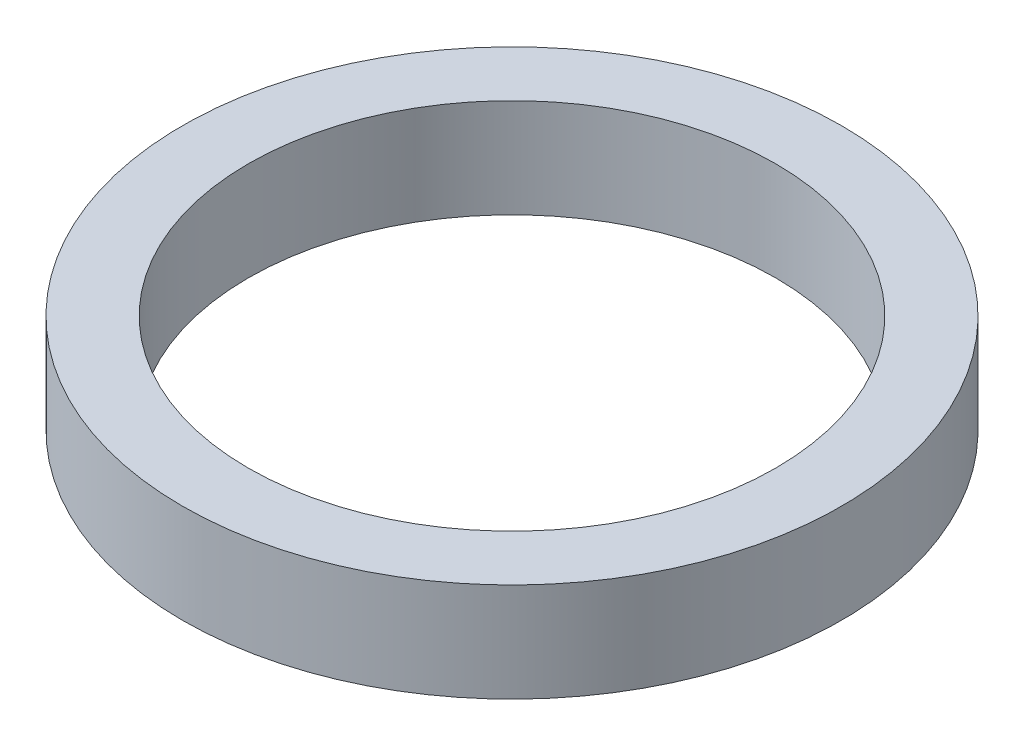
ISO-10303-21;
HEADER;
FILE_DESCRIPTION(('STEP AP214'),'2;1');
FILE_NAME('part.step','',(''),(''),'','','');
FILE_SCHEMA(('AUTOMOTIVE_DESIGN { 1 0 10303 214 1 1 1 1 }'));
ENDSEC;
DATA;
#1=APPLICATION_CONTEXT('core data for automotive mechanical design processes');
#2=APPLICATION_PROTOCOL_DEFINITION('international standard','automotive_design',2000,#1);
#3=PRODUCT_CONTEXT('',#1,'mechanical');
#4=PRODUCT('Part','Part','',(#3));
#5=PRODUCT_RELATED_PRODUCT_CATEGORY('part','',(#4));
#6=PRODUCT_DEFINITION_FORMATION('','',#4);
#7=PRODUCT_DEFINITION_CONTEXT('part definition',#1,'design');
#8=PRODUCT_DEFINITION('design','',#6,#7);
#9=PRODUCT_DEFINITION_SHAPE('','',#8);
#10=(LENGTH_UNIT() NAMED_UNIT(*) SI_UNIT(.MILLI.,.METRE.));
#11=(NAMED_UNIT(*) PLANE_ANGLE_UNIT() SI_UNIT($,.RADIAN.));
#12=(NAMED_UNIT(*) SI_UNIT($,.STERADIAN.) SOLID_ANGLE_UNIT());
#13=UNCERTAINTY_MEASURE_WITH_UNIT(LENGTH_MEASURE(1.E-05),#10,'distance_accuracy_value','');
#14=(GEOMETRIC_REPRESENTATION_CONTEXT(3) GLOBAL_UNCERTAINTY_ASSIGNED_CONTEXT((#13)) GLOBAL_UNIT_ASSIGNED_CONTEXT((#10,
#11,#12)) REPRESENTATION_CONTEXT('',''));
#15=CARTESIAN_POINT('',(0.,0.,0.));
#16=DIRECTION('',(0.,0.,1.));
#17=DIRECTION('',(1.,0.,0.));
#18=AXIS2_PLACEMENT_3D('',#15,#16,#17);
#19=CARTESIAN_POINT('',(0.,1.5,0.));
#20=DIRECTION('',(0.,1.,0.));
#21=DIRECTION('',(0.,0.,1.));
#22=AXIS2_PLACEMENT_3D('',#19,#20,#21);
#23=PLANE('',#22);
#24=CARTESIAN_POINT('',(0.,1.5,0.));
#25=DIRECTION('',(0.,1.,0.));
#26=DIRECTION('',(0.,0.,1.));
#27=AXIS2_PLACEMENT_3D('',#24,#25,#26);
#28=CIRCLE('',#27,5.);
#29=CARTESIAN_POINT('',(0.,1.5,5.));
#30=VERTEX_POINT('',#29);
#31=EDGE_CURVE('E10',#30,#30,#28,.T.);
#32=ORIENTED_EDGE('',*,*,#31,.T.);
#33=EDGE_LOOP('',(#32));
#34=FACE_BOUND('',#33,.T.);
#35=CARTESIAN_POINT('',(0.,1.5,0.));
#36=DIRECTION('',(0.,1.,0.));
#37=DIRECTION('',(0.,0.,1.));
#38=AXIS2_PLACEMENT_3D('',#35,#36,#37);
#39=CIRCLE('',#38,4.);
#40=CARTESIAN_POINT('',(0.,1.5,4.));
#41=VERTEX_POINT('',#40);
#42=EDGE_CURVE('E50',#41,#41,#39,.T.);
#43=ORIENTED_EDGE('',*,*,#42,.F.);
#44=EDGE_LOOP('',(#43));
#45=FACE_BOUND('',#44,.T.);
#46=ADVANCED_FACE('F37',(#34,#45),#23,.T.);
#47=CARTESIAN_POINT('',(0.,0.,0.));
#48=DIRECTION('',(0.,1.,0.));
#49=DIRECTION('',(0.,0.,1.));
#50=AXIS2_PLACEMENT_3D('',#47,#48,#49);
#51=PLANE('',#50);
#52=CARTESIAN_POINT('',(0.,0.,0.));
#53=DIRECTION('',(0.,1.,0.));
#54=DIRECTION('',(0.,0.,1.));
#55=AXIS2_PLACEMENT_3D('',#52,#53,#54);
#56=CIRCLE('',#55,5.);
#57=CARTESIAN_POINT('',(0.,0.,5.));
#58=VERTEX_POINT('',#57);
#59=EDGE_CURVE('E41',#58,#58,#56,.T.);
#60=ORIENTED_EDGE('',*,*,#59,.F.);
#61=EDGE_LOOP('',(#60));
#62=FACE_BOUND('',#61,.T.);
#63=CARTESIAN_POINT('',(0.,0.,0.));
#64=DIRECTION('',(0.,1.,0.));
#65=DIRECTION('',(0.,0.,1.));
#66=AXIS2_PLACEMENT_3D('',#63,#64,#65);
#67=CIRCLE('',#66,4.);
#68=CARTESIAN_POINT('',(0.,0.,4.));
#69=VERTEX_POINT('',#68);
#70=EDGE_CURVE('E52',#69,#69,#67,.T.);
#71=ORIENTED_EDGE('',*,*,#70,.T.);
#72=EDGE_LOOP('',(#71));
#73=FACE_BOUND('',#72,.T.);
#74=ADVANCED_FACE('F64',(#62,#73),#51,.F.);
#75=CARTESIAN_POINT('',(0.,1.5,0.));
#76=DIRECTION('',(0.,-1.,0.));
#77=DIRECTION('',(0.,0.,-1.));
#78=AXIS2_PLACEMENT_3D('',#75,#76,#77);
#79=CYLINDRICAL_SURFACE('',#78,5.);
#80=ORIENTED_EDGE('',*,*,#31,.F.);
#81=EDGE_LOOP('',(#80));
#82=FACE_BOUND('',#81,.T.);
#83=ORIENTED_EDGE('',*,*,#59,.T.);
#84=EDGE_LOOP('',(#83));
#85=FACE_BOUND('',#84,.T.);
#86=ADVANCED_FACE('F39',(#82,#85),#79,.T.);
#87=CARTESIAN_POINT('',(0.,1.5,0.));
#88=DIRECTION('',(0.,-1.,0.));
#89=DIRECTION('',(0.,0.,-1.));
#90=AXIS2_PLACEMENT_3D('',#87,#88,#89);
#91=CYLINDRICAL_SURFACE('',#90,4.);
#92=ORIENTED_EDGE('',*,*,#42,.T.);
#93=EDGE_LOOP('',(#92));
#94=FACE_BOUND('',#93,.T.);
#95=ORIENTED_EDGE('',*,*,#70,.F.);
#96=EDGE_LOOP('',(#95));
#97=FACE_BOUND('',#96,.T.);
#98=ADVANCED_FACE('F60',(#94,#97),#91,.F.);
#99=CLOSED_SHELL('',(#46,#74,#86,#98));
#100=MANIFOLD_SOLID_BREP('B2',#99);
#101=ADVANCED_BREP_SHAPE_REPRESENTATION('',(#18,#100),#14);
#102=SHAPE_DEFINITION_REPRESENTATION(#9,#101);
ENDSEC;
END-ISO-10303-21;
